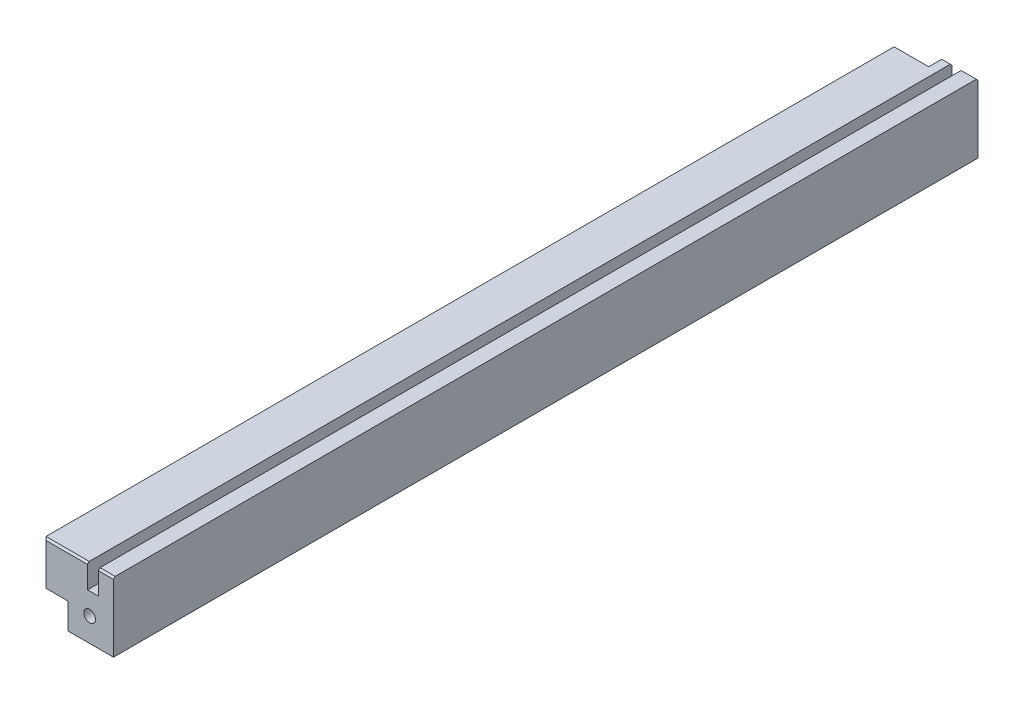
ISO-10303-21;
HEADER;
FILE_DESCRIPTION(('STEP AP214'),'2;1');
FILE_NAME('part.step','',(''),(''),'','','');
FILE_SCHEMA(('AUTOMOTIVE_DESIGN { 1 0 10303 214 1 1 1 1 }'));
ENDSEC;
DATA;
#1=APPLICATION_CONTEXT('core data for automotive mechanical design processes');
#2=APPLICATION_PROTOCOL_DEFINITION('international standard','automotive_design',2000,#1);
#3=PRODUCT_CONTEXT('',#1,'mechanical');
#4=PRODUCT('Part','Part','',(#3));
#5=PRODUCT_RELATED_PRODUCT_CATEGORY('part','',(#4));
#6=PRODUCT_DEFINITION_FORMATION('','',#4);
#7=PRODUCT_DEFINITION_CONTEXT('part definition',#1,'design');
#8=PRODUCT_DEFINITION('design','',#6,#7);
#9=PRODUCT_DEFINITION_SHAPE('','',#8);
#10=(LENGTH_UNIT() NAMED_UNIT(*) SI_UNIT(.MILLI.,.METRE.));
#11=(NAMED_UNIT(*) PLANE_ANGLE_UNIT() SI_UNIT($,.RADIAN.));
#12=(NAMED_UNIT(*) SI_UNIT($,.STERADIAN.) SOLID_ANGLE_UNIT());
#13=UNCERTAINTY_MEASURE_WITH_UNIT(LENGTH_MEASURE(1.E-05),#10,'distance_accuracy_value','');
#14=(GEOMETRIC_REPRESENTATION_CONTEXT(3) GLOBAL_UNCERTAINTY_ASSIGNED_CONTEXT((#13)) GLOBAL_UNIT_ASSIGNED_CONTEXT((#10,
#11,#12)) REPRESENTATION_CONTEXT('',''));
#15=CARTESIAN_POINT('',(0.,0.,0.));
#16=DIRECTION('',(0.,0.,1.));
#17=DIRECTION('',(1.,0.,0.));
#18=AXIS2_PLACEMENT_3D('',#15,#16,#17);
#19=CARTESIAN_POINT('',(-85.5964354489641,5.89468172148585,200.));
#20=DIRECTION('',(0.,-1.,0.));
#21=DIRECTION('',(0.,0.,-1.));
#22=AXIS2_PLACEMENT_3D('',#19,#20,#21);
#23=PLANE('',#22);
#24=DIRECTION('',(0.,0.,-1.));
#25=VECTOR('',#24,1.);
#26=CARTESIAN_POINT('',(-85.5964354489641,5.89468172148585,200.));
#27=LINE('',#26,#25);
#28=CARTESIAN_POINT('',(-85.5964354489641,5.89468172148585,199.6));
#29=VERTEX_POINT('',#28);
#30=CARTESIAN_POINT('',(-85.5964354489641,5.89468172148585,0.400000000000026));
#31=VERTEX_POINT('',#30);
#32=EDGE_CURVE('E222',#29,#31,#27,.T.);
#33=ORIENTED_EDGE('',*,*,#32,.T.);
#34=DIRECTION('',(1.,0.,0.));
#35=VECTOR('',#34,1.);
#36=CARTESIAN_POINT('',(-85.5964354489641,5.89468172148585,0.400000000000026));
#37=LINE('',#36,#35);
#38=CARTESIAN_POINT('',(-89.0964354489641,5.89468172148585,0.400000000000026));
#39=VERTEX_POINT('',#38);
#40=EDGE_CURVE('E261',#39,#31,#37,.T.);
#41=ORIENTED_EDGE('',*,*,#40,.F.);
#42=DIRECTION('',(0.,0.,1.));
#43=VECTOR('',#42,1.);
#44=CARTESIAN_POINT('',(-89.0964354489641,5.89468172148585,0.));
#45=LINE('',#44,#43);
#46=CARTESIAN_POINT('',(-89.0964354489641,5.89468172148585,199.6));
#47=VERTEX_POINT('',#46);
#48=EDGE_CURVE('E216',#39,#47,#45,.T.);
#49=ORIENTED_EDGE('',*,*,#48,.T.);
#50=DIRECTION('',(-1.,0.,0.));
#51=VECTOR('',#50,1.);
#52=CARTESIAN_POINT('',(-89.0964354489641,5.89468172148585,199.6));
#53=LINE('',#52,#51);
#54=EDGE_CURVE('E264',#29,#47,#53,.T.);
#55=ORIENTED_EDGE('',*,*,#54,.F.);
#56=EDGE_LOOP('',(#33,#41,#49,#55));
#57=FACE_BOUND('',#56,.T.);
#58=ADVANCED_FACE('F37',(#57),#23,.F.);
#59=CARTESIAN_POINT('',(-101.596435448964,5.89468172148584,200.));
#60=DIRECTION('',(1.,0.,0.));
#61=DIRECTION('',(0.,-1.,0.));
#62=AXIS2_PLACEMENT_3D('',#59,#60,#61);
#63=PLANE('',#62);
#64=DIRECTION('',(0.,0.,-1.));
#65=VECTOR('',#64,1.);
#66=CARTESIAN_POINT('',(-101.596435448964,-2.10531827851416,3.00000000000006));
#67=LINE('',#66,#65);
#68=CARTESIAN_POINT('',(-101.596435448964,-2.10531827851416,3.40000000000005));
#69=VERTEX_POINT('',#68);
#70=CARTESIAN_POINT('',(-101.596435448964,-2.10531827851416,0.400000000000033));
#71=VERTEX_POINT('',#70);
#72=EDGE_CURVE('E319',#69,#71,#67,.T.);
#73=ORIENTED_EDGE('',*,*,#72,.T.);
#74=DIRECTION('',(0.,1.,0.));
#75=VECTOR('',#74,1.);
#76=CARTESIAN_POINT('',(-101.596435448964,5.89468172148584,0.400000000000026));
#77=LINE('',#76,#75);
#78=CARTESIAN_POINT('',(-101.596435448964,-4.10531827851416,0.400000000000026));
#79=VERTEX_POINT('',#78);
#80=EDGE_CURVE('E236',#79,#71,#77,.T.);
#81=ORIENTED_EDGE('',*,*,#80,.F.);
#82=DIRECTION('',(0.,0.,1.));
#83=VECTOR('',#82,1.);
#84=CARTESIAN_POINT('',(-101.596435448964,-4.10531827851416,0.));
#85=LINE('',#84,#83);
#86=CARTESIAN_POINT('',(-101.596435448964,-4.10531827851416,199.6));
#87=VERTEX_POINT('',#86);
#88=EDGE_CURVE('E198',#79,#87,#85,.T.);
#89=ORIENTED_EDGE('',*,*,#88,.T.);
#90=DIRECTION('',(0.,-1.,0.));
#91=VECTOR('',#90,1.);
#92=CARTESIAN_POINT('',(-101.596435448964,-4.10531827851416,199.6));
#93=LINE('',#92,#91);
#94=CARTESIAN_POINT('',(-101.596435448964,5.89468172148584,199.6));
#95=VERTEX_POINT('',#94);
#96=EDGE_CURVE('E239',#95,#87,#93,.T.);
#97=ORIENTED_EDGE('',*,*,#96,.F.);
#98=DIRECTION('',(0.,0.,-1.));
#99=VECTOR('',#98,1.);
#100=CARTESIAN_POINT('',(-101.596435448964,5.89468172148584,200.));
#101=LINE('',#100,#99);
#102=CARTESIAN_POINT('',(-101.596435448964,5.89468172148584,3.40000000000005));
#103=VERTEX_POINT('',#102);
#104=EDGE_CURVE('E225',#95,#103,#101,.T.);
#105=ORIENTED_EDGE('',*,*,#104,.T.);
#106=DIRECTION('',(0.,1.,0.));
#107=VECTOR('',#106,1.);
#108=CARTESIAN_POINT('',(-101.596435448964,5.89468172148584,3.40000000000005));
#109=LINE('',#108,#107);
#110=EDGE_CURVE('E293',#69,#103,#109,.T.);
#111=ORIENTED_EDGE('',*,*,#110,.F.);
#112=EDGE_LOOP('',(#73,#81,#89,#97,#105,#111));
#113=FACE_BOUND('',#112,.T.);
#114=ADVANCED_FACE('F368',(#113),#63,.F.);
#115=ORIENTED_EDGE('',*,*,#104,.F.);
#116=DIRECTION('',(-1.,0.,0.));
#117=VECTOR('',#116,1.);
#118=CARTESIAN_POINT('',(-101.596435448964,5.89468172148584,199.6));
#119=LINE('',#118,#117);
#120=CARTESIAN_POINT('',(-91.5964354489641,5.89468172148585,199.6));
#121=VERTEX_POINT('',#120);
#122=EDGE_CURVE('E253',#121,#95,#119,.T.);
#123=ORIENTED_EDGE('',*,*,#122,.F.);
#124=DIRECTION('',(0.,0.,1.));
#125=VECTOR('',#124,1.);
#126=CARTESIAN_POINT('',(-91.5964354489641,5.89468172148585,0.));
#127=LINE('',#126,#125);
#128=CARTESIAN_POINT('',(-91.5964354489641,5.89468172148585,0.400000000000026));
#129=VERTEX_POINT('',#128);
#130=EDGE_CURVE('E351',#129,#121,#127,.T.);
#131=ORIENTED_EDGE('',*,*,#130,.F.);
#132=DIRECTION('',(1.,0.,0.));
#133=VECTOR('',#132,1.);
#134=CARTESIAN_POINT('',(-85.5964354489641,5.89468172148585,0.400000000000026));
#135=LINE('',#134,#133);
#136=CARTESIAN_POINT('',(-93.5964354489641,5.89468172148585,0.400000000000027));
#137=VERTEX_POINT('',#136);
#138=EDGE_CURVE('E250',#137,#129,#135,.T.);
#139=ORIENTED_EDGE('',*,*,#138,.F.);
#140=DIRECTION('',(0.,0.,-1.));
#141=VECTOR('',#140,1.);
#142=CARTESIAN_POINT('',(-93.5964354489641,5.89468172148585,3.00000000000006));
#143=LINE('',#142,#141);
#144=CARTESIAN_POINT('',(-93.5964354489641,5.89468172148585,3.40000000000005));
#145=VERTEX_POINT('',#144);
#146=EDGE_CURVE('E303',#145,#137,#143,.T.);
#147=ORIENTED_EDGE('',*,*,#146,.F.);
#148=DIRECTION('',(1.,0.,0.));
#149=VECTOR('',#148,1.);
#150=CARTESIAN_POINT('',(-93.5964354489641,5.89468172148585,3.40000000000005));
#151=LINE('',#150,#149);
#152=EDGE_CURVE('E295',#103,#145,#151,.T.);
#153=ORIENTED_EDGE('',*,*,#152,.F.);
#154=EDGE_LOOP('',(#115,#123,#131,#139,#147,#153));
#155=FACE_BOUND('',#154,.T.);
#156=ADVANCED_FACE('F304',(#155),#23,.F.);
#157=CARTESIAN_POINT('',(-85.5964354489641,5.89468172148585,200.));
#158=DIRECTION('',(-1.,0.,0.));
#159=DIRECTION('',(0.,1.,0.));
#160=AXIS2_PLACEMENT_3D('',#157,#158,#159);
#161=PLANE('',#160);
#162=DIRECTION('',(0.,-1.,0.));
#163=VECTOR('',#162,1.);
#164=CARTESIAN_POINT('',(-85.5964354489641,5.89468172148585,200.));
#165=LINE('',#164,#163);
#166=CARTESIAN_POINT('',(-85.5964354489641,5.49468172148584,200.));
#167=VERTEX_POINT('',#166);
#168=CARTESIAN_POINT('',(-85.5964354489641,-10.1053182785142,200.));
#169=VERTEX_POINT('',#168);
#170=EDGE_CURVE('E212',#167,#169,#165,.T.);
#171=ORIENTED_EDGE('',*,*,#170,.T.);
#172=DIRECTION('',(0.,0.,-1.));
#173=VECTOR('',#172,1.);
#174=CARTESIAN_POINT('',(-85.5964354489641,-10.1053182785142,200.));
#175=LINE('',#174,#173);
#176=CARTESIAN_POINT('',(-85.5964354489641,-10.1053182785142,0.));
#177=VERTEX_POINT('',#176);
#178=EDGE_CURVE('E220',#169,#177,#175,.T.);
#179=ORIENTED_EDGE('',*,*,#178,.T.);
#180=DIRECTION('',(0.,-1.,0.));
#181=VECTOR('',#180,1.);
#182=CARTESIAN_POINT('',(-85.5964354489641,5.89468172148585,0.));
#183=LINE('',#182,#181);
#184=CARTESIAN_POINT('',(-85.5964354489641,5.49468172148584,0.));
#185=VERTEX_POINT('',#184);
#186=EDGE_CURVE('E210',#185,#177,#183,.T.);
#187=ORIENTED_EDGE('',*,*,#186,.F.);
#188=DIRECTION('',(0.,0.707106781186548,0.707106781186548));
#189=VECTOR('',#188,1.);
#190=CARTESIAN_POINT('',(-85.5964354489641,5.89468172148585,0.400000000000026));
#191=LINE('',#190,#189);
#192=EDGE_CURVE('E256',#31,#185,#191,.F.);
#193=ORIENTED_EDGE('',*,*,#192,.F.);
#194=ORIENTED_EDGE('',*,*,#32,.F.);
#195=DIRECTION('',(0.,0.707106781186548,-0.707106781186548));
#196=VECTOR('',#195,1.);
#197=CARTESIAN_POINT('',(-85.5964354489641,5.49468172148584,200.));
#198=LINE('',#197,#196);
#199=EDGE_CURVE('E259',#167,#29,#198,.T.);
#200=ORIENTED_EDGE('',*,*,#199,.F.);
#201=EDGE_LOOP('',(#171,#179,#187,#193,#194,#200));
#202=FACE_BOUND('',#201,.T.);
#203=ADVANCED_FACE('F439',(#202),#161,.F.);
#204=CARTESIAN_POINT('',(-85.5964354489641,-10.1053182785142,200.));
#205=DIRECTION('',(0.,1.,0.));
#206=DIRECTION('',(0.,0.,1.));
#207=AXIS2_PLACEMENT_3D('',#204,#205,#206);
#208=PLANE('',#207);
#209=DIRECTION('',(-1.,0.,0.));
#210=VECTOR('',#209,1.);
#211=CARTESIAN_POINT('',(-85.5964354489641,-10.1053182785142,0.));
#212=LINE('',#211,#210);
#213=CARTESIAN_POINT('',(-96.0964354489642,-10.1053182785142,0.));
#214=VERTEX_POINT('',#213);
#215=EDGE_CURVE('E204',#177,#214,#212,.T.);
#216=ORIENTED_EDGE('',*,*,#215,.F.);
#217=ORIENTED_EDGE('',*,*,#178,.F.);
#218=DIRECTION('',(-1.,0.,0.));
#219=VECTOR('',#218,1.);
#220=CARTESIAN_POINT('',(-85.5964354489641,-10.1053182785142,200.));
#221=LINE('',#220,#219);
#222=CARTESIAN_POINT('',(-96.0964354489642,-10.1053182785142,200.));
#223=VERTEX_POINT('',#222);
#224=EDGE_CURVE('E206',#169,#223,#221,.T.);
#225=ORIENTED_EDGE('',*,*,#224,.T.);
#226=DIRECTION('',(0.,0.,-1.));
#227=VECTOR('',#226,1.);
#228=CARTESIAN_POINT('',(-96.0964354489642,-10.1053182785142,0.));
#229=LINE('',#228,#227);
#230=EDGE_CURVE('E191',#223,#214,#229,.T.);
#231=ORIENTED_EDGE('',*,*,#230,.T.);
#232=EDGE_LOOP('',(#216,#217,#225,#231));
#233=FACE_BOUND('',#232,.T.);
#234=ADVANCED_FACE('F202',(#233),#208,.F.);
#235=CARTESIAN_POINT('',(-93.5964354489641,-2.10531827851415,200.));
#236=DIRECTION('',(0.,0.,1.));
#237=DIRECTION('',(-1.,0.,0.));
#238=AXIS2_PLACEMENT_3D('',#235,#236,#237);
#239=PLANE('',#238);
#240=ORIENTED_EDGE('',*,*,#224,.F.);
#241=ORIENTED_EDGE('',*,*,#170,.F.);
#242=DIRECTION('',(1.,0.,0.));
#243=VECTOR('',#242,1.);
#244=CARTESIAN_POINT('',(-85.5964354489641,5.49468172148584,200.));
#245=LINE('',#244,#243);
#246=CARTESIAN_POINT('',(-89.0964354489641,5.49468172148584,200.));
#247=VERTEX_POINT('',#246);
#248=EDGE_CURVE('E228',#247,#167,#245,.T.);
#249=ORIENTED_EDGE('',*,*,#248,.F.);
#250=DIRECTION('',(0.,-1.,0.));
#251=VECTOR('',#250,1.);
#252=CARTESIAN_POINT('',(-89.0964354489641,5.89468172148585,200.));
#253=LINE('',#252,#251);
#254=CARTESIAN_POINT('',(-89.0964354489641,0.394681721485848,200.));
#255=VERTEX_POINT('',#254);
#256=EDGE_CURVE('E341',#247,#255,#253,.T.);
#257=ORIENTED_EDGE('',*,*,#256,.T.);
#258=DIRECTION('',(-1.,0.,0.));
#259=VECTOR('',#258,1.);
#260=CARTESIAN_POINT('',(-89.0964354489641,0.394681721485848,200.));
#261=LINE('',#260,#259);
#262=CARTESIAN_POINT('',(-91.5964354489641,0.394681721485847,200.));
#263=VERTEX_POINT('',#262);
#264=EDGE_CURVE('E344',#255,#263,#261,.T.);
#265=ORIENTED_EDGE('',*,*,#264,.T.);
#266=DIRECTION('',(0.,1.,0.));
#267=VECTOR('',#266,1.);
#268=CARTESIAN_POINT('',(-91.5964354489641,5.89468172148585,200.));
#269=LINE('',#268,#267);
#270=CARTESIAN_POINT('',(-91.5964354489641,5.49468172148584,200.));
#271=VERTEX_POINT('',#270);
#272=EDGE_CURVE('E334',#263,#271,#269,.T.);
#273=ORIENTED_EDGE('',*,*,#272,.T.);
#274=DIRECTION('',(1.,0.,0.));
#275=VECTOR('',#274,1.);
#276=CARTESIAN_POINT('',(-91.5964354489641,5.49468172148584,200.));
#277=LINE('',#276,#275);
#278=CARTESIAN_POINT('',(-101.196435448964,5.49468172148583,200.));
#279=VERTEX_POINT('',#278);
#280=EDGE_CURVE('E230',#279,#271,#277,.T.);
#281=ORIENTED_EDGE('',*,*,#280,.F.);
#282=DIRECTION('',(0.,1.,0.));
#283=VECTOR('',#282,1.);
#284=CARTESIAN_POINT('',(-101.196435448964,5.89468172148584,200.));
#285=LINE('',#284,#283);
#286=CARTESIAN_POINT('',(-101.196435448964,-4.10531827851416,200.));
#287=VERTEX_POINT('',#286);
#288=EDGE_CURVE('E233',#287,#279,#285,.T.);
#289=ORIENTED_EDGE('',*,*,#288,.F.);
#290=DIRECTION('',(1.,0.,0.));
#291=VECTOR('',#290,1.);
#292=CARTESIAN_POINT('',(-101.596435448964,-4.10531827851416,200.));
#293=LINE('',#292,#291);
#294=CARTESIAN_POINT('',(-96.0964354489642,-4.10531827851416,200.));
#295=VERTEX_POINT('',#294);
#296=EDGE_CURVE('E283',#287,#295,#293,.T.);
#297=ORIENTED_EDGE('',*,*,#296,.T.);
#298=DIRECTION('',(0.,-1.,0.));
#299=VECTOR('',#298,1.);
#300=CARTESIAN_POINT('',(-96.0964354489642,-6.60531827851416,200.));
#301=LINE('',#300,#299);
#302=EDGE_CURVE('E357',#295,#223,#301,.T.);
#303=ORIENTED_EDGE('',*,*,#302,.T.);
#304=EDGE_LOOP('',(#240,#241,#249,#257,#265,#273,#281,#289,#297,#303));
#305=FACE_BOUND('',#304,.T.);
#306=CARTESIAN_POINT('',(-91.0964354489641,-4.60531827851415,200.));
#307=DIRECTION('',(0.,0.,-1.));
#308=DIRECTION('',(-1.,0.,0.));
#309=AXIS2_PLACEMENT_3D('',#306,#307,#308);
#310=CIRCLE('',#309,1.34999999999999);
#311=CARTESIAN_POINT('',(-92.4464354489641,-4.60531827851416,200.));
#312=VERTEX_POINT('',#311);
#313=EDGE_CURVE('E306',#312,#312,#310,.T.);
#314=ORIENTED_EDGE('',*,*,#313,.T.);
#315=EDGE_LOOP('',(#314));
#316=FACE_BOUND('',#315,.T.);
#317=ADVANCED_FACE('F389',(#305,#316),#239,.T.);
#318=CARTESIAN_POINT('',(-93.5964354489641,-2.10531827851415,0.));
#319=DIRECTION('',(0.,0.,1.));
#320=DIRECTION('',(-1.,0.,0.));
#321=AXIS2_PLACEMENT_3D('',#318,#319,#320);
#322=PLANE('',#321);
#323=CARTESIAN_POINT('',(-91.0964354489641,-4.60531827851415,0.));
#324=DIRECTION('',(0.,0.,1.));
#325=DIRECTION('',(1.,0.,0.));
#326=AXIS2_PLACEMENT_3D('',#323,#324,#325);
#327=CIRCLE('',#326,1.34999999999999);
#328=CARTESIAN_POINT('',(-89.7464354489642,-4.60531827851415,0.));
#329=VERTEX_POINT('',#328);
#330=EDGE_CURVE('E325',#329,#329,#327,.T.);
#331=ORIENTED_EDGE('',*,*,#330,.T.);
#332=EDGE_LOOP('',(#331));
#333=FACE_BOUND('',#332,.T.);
#334=DIRECTION('',(0.,-1.,0.));
#335=VECTOR('',#334,1.);
#336=CARTESIAN_POINT('',(-96.0964354489642,-6.60531827851416,0.));
#337=LINE('',#336,#335);
#338=CARTESIAN_POINT('',(-96.0964354489642,-4.10531827851416,0.));
#339=VERTEX_POINT('',#338);
#340=EDGE_CURVE('E187',#339,#214,#337,.T.);
#341=ORIENTED_EDGE('',*,*,#340,.F.);
#342=DIRECTION('',(1.,0.,0.));
#343=VECTOR('',#342,1.);
#344=CARTESIAN_POINT('',(-101.596435448964,-4.10531827851416,0.));
#345=LINE('',#344,#343);
#346=CARTESIAN_POINT('',(-101.196435448964,-4.10531827851416,0.));
#347=VERTEX_POINT('',#346);
#348=EDGE_CURVE('E199',#347,#339,#345,.T.);
#349=ORIENTED_EDGE('',*,*,#348,.F.);
#350=DIRECTION('',(0.,-1.,0.));
#351=VECTOR('',#350,1.);
#352=CARTESIAN_POINT('',(-101.196435448964,-2.10531827851416,0.));
#353=LINE('',#352,#351);
#354=CARTESIAN_POINT('',(-101.196435448964,-2.10531827851416,0.));
#355=VERTEX_POINT('',#354);
#356=EDGE_CURVE('E274',#355,#347,#353,.T.);
#357=ORIENTED_EDGE('',*,*,#356,.F.);
#358=DIRECTION('',(1.,0.,0.));
#359=VECTOR('',#358,1.);
#360=CARTESIAN_POINT('',(-101.596435448964,-2.10531827851416,0.));
#361=LINE('',#360,#359);
#362=CARTESIAN_POINT('',(-96.5964354489642,-2.10531827851416,0.));
#363=VERTEX_POINT('',#362);
#364=EDGE_CURVE('E384',#355,#363,#361,.T.);
#365=ORIENTED_EDGE('',*,*,#364,.T.);
#366=CARTESIAN_POINT('',(-96.5964354489642,0.894681721485843,0.));
#367=DIRECTION('',(0.,0.,1.));
#368=DIRECTION('',(1.,0.,0.));
#369=AXIS2_PLACEMENT_3D('',#366,#367,#368);
#370=CIRCLE('',#369,3.);
#371=CARTESIAN_POINT('',(-93.5964354489641,0.894681721485845,0.));
#372=VERTEX_POINT('',#371);
#373=EDGE_CURVE('E405',#363,#372,#370,.T.);
#374=ORIENTED_EDGE('',*,*,#373,.T.);
#375=DIRECTION('',(0.,1.,0.));
#376=VECTOR('',#375,1.);
#377=CARTESIAN_POINT('',(-93.5964354489641,5.89468172148585,0.));
#378=LINE('',#377,#376);
#379=CARTESIAN_POINT('',(-93.5964354489641,5.49468172148583,0.));
#380=VERTEX_POINT('',#379);
#381=EDGE_CURVE('E315',#372,#380,#378,.T.);
#382=ORIENTED_EDGE('',*,*,#381,.T.);
#383=DIRECTION('',(-1.,0.,0.));
#384=VECTOR('',#383,1.);
#385=CARTESIAN_POINT('',(-93.5964354489641,5.49468172148583,0.));
#386=LINE('',#385,#384);
#387=CARTESIAN_POINT('',(-91.5964354489641,5.49468172148584,0.));
#388=VERTEX_POINT('',#387);
#389=EDGE_CURVE('E277',#388,#380,#386,.T.);
#390=ORIENTED_EDGE('',*,*,#389,.F.);
#391=DIRECTION('',(0.,1.,0.));
#392=VECTOR('',#391,1.);
#393=CARTESIAN_POINT('',(-91.5964354489641,5.89468172148585,0.));
#394=LINE('',#393,#392);
#395=CARTESIAN_POINT('',(-91.5964354489641,0.394681721485847,0.));
#396=VERTEX_POINT('',#395);
#397=EDGE_CURVE('E337',#396,#388,#394,.T.);
#398=ORIENTED_EDGE('',*,*,#397,.F.);
#399=DIRECTION('',(-1.,0.,0.));
#400=VECTOR('',#399,1.);
#401=CARTESIAN_POINT('',(-89.0964354489641,0.394681721485848,0.));
#402=LINE('',#401,#400);
#403=CARTESIAN_POINT('',(-89.0964354489641,0.394681721485848,0.));
#404=VERTEX_POINT('',#403);
#405=EDGE_CURVE('E333',#404,#396,#402,.T.);
#406=ORIENTED_EDGE('',*,*,#405,.F.);
#407=DIRECTION('',(0.,-1.,0.));
#408=VECTOR('',#407,1.);
#409=CARTESIAN_POINT('',(-89.0964354489641,5.89468172148585,0.));
#410=LINE('',#409,#408);
#411=CARTESIAN_POINT('',(-89.0964354489641,5.49468172148584,0.));
#412=VERTEX_POINT('',#411);
#413=EDGE_CURVE('E330',#412,#404,#410,.T.);
#414=ORIENTED_EDGE('',*,*,#413,.F.);
#415=DIRECTION('',(-1.,0.,0.));
#416=VECTOR('',#415,1.);
#417=CARTESIAN_POINT('',(-93.5964354489641,5.49468172148583,0.));
#418=LINE('',#417,#416);
#419=EDGE_CURVE('E271',#185,#412,#418,.T.);
#420=ORIENTED_EDGE('',*,*,#419,.F.);
#421=ORIENTED_EDGE('',*,*,#186,.T.);
#422=ORIENTED_EDGE('',*,*,#215,.T.);
#423=EDGE_LOOP('',(#341,#349,#357,#365,#374,#382,#390,#398,#406,#414,#420,#421,#422));
#424=FACE_BOUND('',#423,.T.);
#425=ADVANCED_FACE('F208',(#333,#424),#322,.F.);
#426=CARTESIAN_POINT('',(-96.0964354489642,-6.60531827851416,0.));
#427=DIRECTION('',(1.,0.,0.));
#428=DIRECTION('',(0.,0.,1.));
#429=AXIS2_PLACEMENT_3D('',#426,#427,#428);
#430=PLANE('',#429);
#431=ORIENTED_EDGE('',*,*,#302,.F.);
#432=DIRECTION('',(0.,0.,1.));
#433=VECTOR('',#432,1.);
#434=CARTESIAN_POINT('',(-96.0964354489642,-4.10531827851416,0.));
#435=LINE('',#434,#433);
#436=EDGE_CURVE('E193',#339,#295,#435,.T.);
#437=ORIENTED_EDGE('',*,*,#436,.F.);
#438=ORIENTED_EDGE('',*,*,#340,.T.);
#439=ORIENTED_EDGE('',*,*,#230,.F.);
#440=EDGE_LOOP('',(#431,#437,#438,#439));
#441=FACE_BOUND('',#440,.T.);
#442=ADVANCED_FACE('F190',(#441),#430,.F.);
#443=CARTESIAN_POINT('',(-101.596435448964,-4.10531827851416,0.));
#444=DIRECTION('',(0.,1.,0.));
#445=DIRECTION('',(1.,0.,0.));
#446=AXIS2_PLACEMENT_3D('',#443,#444,#445);
#447=PLANE('',#446);
#448=ORIENTED_EDGE('',*,*,#88,.F.);
#449=DIRECTION('',(0.707106781186548,0.,-0.707106781186548));
#450=VECTOR('',#449,1.);
#451=CARTESIAN_POINT('',(-101.596435448964,-4.10531827851416,0.400000000000026));
#452=LINE('',#451,#450);
#453=EDGE_CURVE('E242',#347,#79,#452,.F.);
#454=ORIENTED_EDGE('',*,*,#453,.F.);
#455=ORIENTED_EDGE('',*,*,#348,.T.);
#456=ORIENTED_EDGE('',*,*,#436,.T.);
#457=ORIENTED_EDGE('',*,*,#296,.F.);
#458=DIRECTION('',(0.707106781186548,0.,0.707106781186548));
#459=VECTOR('',#458,1.);
#460=CARTESIAN_POINT('',(-101.196435448964,-4.10531827851416,200.));
#461=LINE('',#460,#459);
#462=EDGE_CURVE('E244',#87,#287,#461,.T.);
#463=ORIENTED_EDGE('',*,*,#462,.F.);
#464=EDGE_LOOP('',(#448,#454,#455,#456,#457,#463));
#465=FACE_BOUND('',#464,.T.);
#466=ADVANCED_FACE('F370',(#465),#447,.F.);
#467=CARTESIAN_POINT('',(-89.0964354489641,5.89468172148585,0.));
#468=DIRECTION('',(1.,0.,0.));
#469=DIRECTION('',(0.,-1.,0.));
#470=AXIS2_PLACEMENT_3D('',#467,#468,#469);
#471=PLANE('',#470);
#472=ORIENTED_EDGE('',*,*,#48,.F.);
#473=DIRECTION('',(0.,-0.707106781186548,-0.707106781186548));
#474=VECTOR('',#473,1.);
#475=CARTESIAN_POINT('',(-89.0964354489641,5.89468172148585,0.400000000000026));
#476=LINE('',#475,#474);
#477=EDGE_CURVE('E267',#412,#39,#476,.F.);
#478=ORIENTED_EDGE('',*,*,#477,.F.);
#479=ORIENTED_EDGE('',*,*,#413,.T.);
#480=DIRECTION('',(0.,0.,1.));
#481=VECTOR('',#480,1.);
#482=CARTESIAN_POINT('',(-89.0964354489641,0.394681721485848,0.));
#483=LINE('',#482,#481);
#484=EDGE_CURVE('E340',#404,#255,#483,.T.);
#485=ORIENTED_EDGE('',*,*,#484,.T.);
#486=ORIENTED_EDGE('',*,*,#256,.F.);
#487=DIRECTION('',(0.,-0.707106781186548,0.707106781186548));
#488=VECTOR('',#487,1.);
#489=CARTESIAN_POINT('',(-89.0964354489641,5.49468172148584,200.));
#490=LINE('',#489,#488);
#491=EDGE_CURVE('E269',#47,#247,#490,.T.);
#492=ORIENTED_EDGE('',*,*,#491,.F.);
#493=EDGE_LOOP('',(#472,#478,#479,#485,#486,#492));
#494=FACE_BOUND('',#493,.T.);
#495=ADVANCED_FACE('F456',(#494),#471,.F.);
#496=CARTESIAN_POINT('',(-91.5964354489641,5.89468172148585,0.));
#497=DIRECTION('',(-1.,0.,0.));
#498=DIRECTION('',(0.,1.,0.));
#499=AXIS2_PLACEMENT_3D('',#496,#497,#498);
#500=PLANE('',#499);
#501=ORIENTED_EDGE('',*,*,#272,.F.);
#502=DIRECTION('',(0.,0.,1.));
#503=VECTOR('',#502,1.);
#504=CARTESIAN_POINT('',(-91.5964354489641,0.394681721485847,0.));
#505=LINE('',#504,#503);
#506=EDGE_CURVE('E354',#396,#263,#505,.T.);
#507=ORIENTED_EDGE('',*,*,#506,.F.);
#508=ORIENTED_EDGE('',*,*,#397,.T.);
#509=DIRECTION('',(0.,0.707106781186548,0.707106781186548));
#510=VECTOR('',#509,1.);
#511=CARTESIAN_POINT('',(-91.5964354489641,5.89468172148585,0.400000000000027));
#512=LINE('',#511,#510);
#513=EDGE_CURVE('E246',#129,#388,#512,.F.);
#514=ORIENTED_EDGE('',*,*,#513,.F.);
#515=ORIENTED_EDGE('',*,*,#130,.T.);
#516=DIRECTION('',(0.,0.707106781186548,-0.707106781186548));
#517=VECTOR('',#516,1.);
#518=CARTESIAN_POINT('',(-91.5964354489641,5.49468172148584,200.));
#519=LINE('',#518,#517);
#520=EDGE_CURVE('E248',#271,#121,#519,.T.);
#521=ORIENTED_EDGE('',*,*,#520,.F.);
#522=EDGE_LOOP('',(#501,#507,#508,#514,#515,#521));
#523=FACE_BOUND('',#522,.T.);
#524=ADVANCED_FACE('F394',(#523),#500,.F.);
#525=CARTESIAN_POINT('',(-89.0964354489641,0.394681721485848,0.));
#526=DIRECTION('',(0.,-1.,0.));
#527=DIRECTION('',(0.,0.,-1.));
#528=AXIS2_PLACEMENT_3D('',#525,#526,#527);
#529=PLANE('',#528);
#530=ORIENTED_EDGE('',*,*,#264,.F.);
#531=ORIENTED_EDGE('',*,*,#484,.F.);
#532=ORIENTED_EDGE('',*,*,#405,.T.);
#533=ORIENTED_EDGE('',*,*,#506,.T.);
#534=EDGE_LOOP('',(#530,#531,#532,#533));
#535=FACE_BOUND('',#534,.T.);
#536=ADVANCED_FACE('F462',(#535),#529,.F.);
#537=CARTESIAN_POINT('',(-93.5964354489641,5.49468172148583,200.));
#538=DIRECTION('',(0.,0.707106781186548,0.707106781186548));
#539=DIRECTION('',(-1.,0.,0.));
#540=AXIS2_PLACEMENT_3D('',#537,#538,#539);
#541=PLANE('',#540);
#542=ORIENTED_EDGE('',*,*,#520,.T.);
#543=ORIENTED_EDGE('',*,*,#122,.T.);
#544=DIRECTION('',(-0.577350269189626,0.577350269189626,-0.577350269189626));
#545=VECTOR('',#544,1.);
#546=CARTESIAN_POINT('',(-98.6631021156308,2.9613483881525,202.533333333333));
#547=LINE('',#546,#545);
#548=EDGE_CURVE('E281',#95,#279,#547,.F.);
#549=ORIENTED_EDGE('',*,*,#548,.T.);
#550=ORIENTED_EDGE('',*,*,#280,.T.);
#551=EDGE_LOOP('',(#542,#543,#549,#550));
#552=FACE_BOUND('',#551,.T.);
#553=ADVANCED_FACE('F378',(#552),#541,.T.);
#554=CARTESIAN_POINT('',(-101.196435448964,-2.10531827851416,200.));
#555=DIRECTION('',(-0.707106781186548,0.,0.707106781186548));
#556=DIRECTION('',(0.,-1.,0.));
#557=AXIS2_PLACEMENT_3D('',#554,#555,#556);
#558=PLANE('',#557);
#559=ORIENTED_EDGE('',*,*,#462,.T.);
#560=ORIENTED_EDGE('',*,*,#288,.T.);
#561=ORIENTED_EDGE('',*,*,#548,.F.);
#562=ORIENTED_EDGE('',*,*,#96,.T.);
#563=EDGE_LOOP('',(#559,#560,#561,#562));
#564=FACE_BOUND('',#563,.T.);
#565=ADVANCED_FACE('F374',(#564),#558,.T.);
#566=CARTESIAN_POINT('',(-93.5964354489641,5.49468172148583,200.));
#567=DIRECTION('',(0.,0.707106781186548,0.707106781186548));
#568=DIRECTION('',(-1.,0.,0.));
#569=AXIS2_PLACEMENT_3D('',#566,#567,#568);
#570=PLANE('',#569);
#571=ORIENTED_EDGE('',*,*,#491,.T.);
#572=ORIENTED_EDGE('',*,*,#248,.T.);
#573=ORIENTED_EDGE('',*,*,#199,.T.);
#574=ORIENTED_EDGE('',*,*,#54,.T.);
#575=EDGE_LOOP('',(#571,#572,#573,#574));
#576=FACE_BOUND('',#575,.T.);
#577=ADVANCED_FACE('F538',(#576),#570,.T.);
#578=CARTESIAN_POINT('',(-101.596435448964,5.89468172148584,0.400000000000026));
#579=DIRECTION('',(0.707106781186548,0.,0.707106781186548));
#580=DIRECTION('',(0.,1.,0.));
#581=AXIS2_PLACEMENT_3D('',#578,#579,#580);
#582=PLANE('',#581);
#583=DIRECTION('',(-0.707106781186548,0.,0.707106781186548));
#584=VECTOR('',#583,1.);
#585=CARTESIAN_POINT('',(-101.596435448964,-2.10531827851416,0.400000000000025));
#586=LINE('',#585,#584);
#587=EDGE_CURVE('E286',#71,#355,#586,.F.);
#588=ORIENTED_EDGE('',*,*,#587,.T.);
#589=ORIENTED_EDGE('',*,*,#356,.T.);
#590=ORIENTED_EDGE('',*,*,#453,.T.);
#591=ORIENTED_EDGE('',*,*,#80,.T.);
#592=EDGE_LOOP('',(#588,#589,#590,#591));
#593=FACE_BOUND('',#592,.T.);
#594=ADVANCED_FACE('F387',(#593),#582,.F.);
#595=CARTESIAN_POINT('',(-85.5964354489641,5.89468172148585,0.400000000000026));
#596=DIRECTION('',(0.,-0.707106781186548,0.707106781186548));
#597=DIRECTION('',(1.,0.,0.));
#598=AXIS2_PLACEMENT_3D('',#595,#596,#597);
#599=PLANE('',#598);
#600=DIRECTION('',(0.,-0.707106781186548,-0.707106781186548));
#601=VECTOR('',#600,1.);
#602=CARTESIAN_POINT('',(-93.5964354489641,5.89468172148585,0.400000000000026));
#603=LINE('',#602,#601);
#604=EDGE_CURVE('E280',#380,#137,#603,.F.);
#605=ORIENTED_EDGE('',*,*,#604,.T.);
#606=ORIENTED_EDGE('',*,*,#138,.T.);
#607=ORIENTED_EDGE('',*,*,#513,.T.);
#608=ORIENTED_EDGE('',*,*,#389,.T.);
#609=EDGE_LOOP('',(#605,#606,#607,#608));
#610=FACE_BOUND('',#609,.T.);
#611=ADVANCED_FACE('F398',(#610),#599,.F.);
#612=CARTESIAN_POINT('',(-85.5964354489641,5.89468172148585,0.400000000000026));
#613=DIRECTION('',(0.,-0.707106781186548,0.707106781186548));
#614=DIRECTION('',(1.,0.,0.));
#615=AXIS2_PLACEMENT_3D('',#612,#613,#614);
#616=PLANE('',#615);
#617=ORIENTED_EDGE('',*,*,#477,.T.);
#618=ORIENTED_EDGE('',*,*,#40,.T.);
#619=ORIENTED_EDGE('',*,*,#192,.T.);
#620=ORIENTED_EDGE('',*,*,#419,.T.);
#621=EDGE_LOOP('',(#617,#618,#619,#620));
#622=FACE_BOUND('',#621,.T.);
#623=ADVANCED_FACE('F472',(#622),#616,.F.);
#624=CARTESIAN_POINT('',(-91.0964354489641,-4.60531827851415,14.1888381643128));
#625=DIRECTION('',(0.,0.,-1.));
#626=DIRECTION('',(1.,0.,0.));
#627=AXIS2_PLACEMENT_3D('',#624,#625,#626);
#628=CONICAL_SURFACE('',#627,1.35,1.02974425867665);
#629=CARTESIAN_POINT('',(-91.0964354489641,-4.60531827851415,15.));
#630=VERTEX_POINT('',#629);
#631=VERTEX_LOOP('',#630);
#632=FACE_BOUND('',#631,.T.);
#633=CARTESIAN_POINT('',(-91.0964354489641,-4.60531827851415,14.1888381643128));
#634=DIRECTION('',(0.,0.,1.));
#635=DIRECTION('',(1.,0.,0.));
#636=AXIS2_PLACEMENT_3D('',#633,#634,#635);
#637=CIRCLE('',#636,1.35);
#638=CARTESIAN_POINT('',(-89.7464354489641,-4.60531827851415,14.1888381643128));
#639=VERTEX_POINT('',#638);
#640=EDGE_CURVE('E284',#639,#639,#637,.T.);
#641=ORIENTED_EDGE('',*,*,#640,.F.);
#642=EDGE_LOOP('',(#641));
#643=FACE_BOUND('',#642,.T.);
#644=ADVANCED_FACE('F468',(#632,#643),#628,.F.);
#645=CARTESIAN_POINT('',(-91.0964354489641,-4.60531827851415,0.));
#646=DIRECTION('',(0.,0.,-1.));
#647=DIRECTION('',(1.,0.,0.));
#648=AXIS2_PLACEMENT_3D('',#645,#646,#647);
#649=CYLINDRICAL_SURFACE('',#648,1.34999999999999);
#650=ORIENTED_EDGE('',*,*,#640,.T.);
#651=EDGE_LOOP('',(#650));
#652=FACE_BOUND('',#651,.T.);
#653=ORIENTED_EDGE('',*,*,#330,.F.);
#654=EDGE_LOOP('',(#653));
#655=FACE_BOUND('',#654,.T.);
#656=ADVANCED_FACE('F471',(#652,#655),#649,.F.);
#657=CARTESIAN_POINT('',(-91.0964354489641,-4.60531827851415,185.811161835687));
#658=DIRECTION('',(0.,0.,1.));
#659=DIRECTION('',(-1.,0.,0.));
#660=AXIS2_PLACEMENT_3D('',#657,#658,#659);
#661=CONICAL_SURFACE('',#660,1.35,1.02974425867665);
#662=CARTESIAN_POINT('',(-91.0964354489641,-4.60531827851415,185.));
#663=VERTEX_POINT('',#662);
#664=VERTEX_LOOP('',#663);
#665=FACE_BOUND('',#664,.T.);
#666=CARTESIAN_POINT('',(-91.0964354489641,-4.60531827851415,185.811161835687));
#667=DIRECTION('',(0.,0.,-1.));
#668=DIRECTION('',(-1.,0.,0.));
#669=AXIS2_PLACEMENT_3D('',#666,#667,#668);
#670=CIRCLE('',#669,1.35);
#671=CARTESIAN_POINT('',(-92.4464354489642,-4.60531827851416,185.811161835687));
#672=VERTEX_POINT('',#671);
#673=EDGE_CURVE('E310',#672,#672,#670,.T.);
#674=ORIENTED_EDGE('',*,*,#673,.F.);
#675=EDGE_LOOP('',(#674));
#676=FACE_BOUND('',#675,.T.);
#677=ADVANCED_FACE('F476',(#665,#676),#661,.F.);
#678=CARTESIAN_POINT('',(-91.0964354489641,-4.60531827851415,200.));
#679=DIRECTION('',(0.,0.,1.));
#680=DIRECTION('',(-1.,0.,0.));
#681=AXIS2_PLACEMENT_3D('',#678,#679,#680);
#682=CYLINDRICAL_SURFACE('',#681,1.34999999999999);
#683=ORIENTED_EDGE('',*,*,#673,.T.);
#684=EDGE_LOOP('',(#683));
#685=FACE_BOUND('',#684,.T.);
#686=ORIENTED_EDGE('',*,*,#313,.F.);
#687=EDGE_LOOP('',(#686));
#688=FACE_BOUND('',#687,.T.);
#689=ADVANCED_FACE('F428',(#685,#688),#682,.F.);
#690=CARTESIAN_POINT('',(-93.5964354489641,5.89468172148585,3.00000000000006));
#691=DIRECTION('',(1.,0.,0.));
#692=DIRECTION('',(0.,0.,1.));
#693=AXIS2_PLACEMENT_3D('',#690,#691,#692);
#694=PLANE('',#693);
#695=ORIENTED_EDGE('',*,*,#604,.F.);
#696=ORIENTED_EDGE('',*,*,#381,.F.);
#697=DIRECTION('',(0.,0.,-1.));
#698=VECTOR('',#697,1.);
#699=CARTESIAN_POINT('',(-93.5964354489641,0.894681721485845,3.00000000000006));
#700=LINE('',#699,#698);
#701=CARTESIAN_POINT('',(-93.5964354489641,0.894681721485845,3.00000000000006));
#702=VERTEX_POINT('',#701);
#703=EDGE_CURVE('E307',#702,#372,#700,.T.);
#704=ORIENTED_EDGE('',*,*,#703,.F.);
#705=DIRECTION('',(0.,1.,0.));
#706=VECTOR('',#705,1.);
#707=CARTESIAN_POINT('',(-93.5964354489641,5.89468172148585,3.00000000000006));
#708=LINE('',#707,#706);
#709=CARTESIAN_POINT('',(-93.5964354489641,5.49468172148583,3.00000000000006));
#710=VERTEX_POINT('',#709);
#711=EDGE_CURVE('E321',#702,#710,#708,.T.);
#712=ORIENTED_EDGE('',*,*,#711,.T.);
#713=DIRECTION('',(0.,-0.70710678118657,-0.707106781186525));
#714=VECTOR('',#713,1.);
#715=CARTESIAN_POINT('',(-93.5964354489641,5.69468172148585,3.20000000000007));
#716=LINE('',#715,#714);
#717=EDGE_CURVE('E11',#145,#710,#716,.T.);
#718=ORIENTED_EDGE('',*,*,#717,.F.);
#719=ORIENTED_EDGE('',*,*,#146,.T.);
#720=EDGE_LOOP('',(#695,#696,#704,#712,#718,#719));
#721=FACE_BOUND('',#720,.T.);
#722=ADVANCED_FACE('F401',(#721),#694,.F.);
#723=CARTESIAN_POINT('',(-96.5964354489642,0.894681721485843,3.00000000000006));
#724=DIRECTION('',(0.,0.,-1.));
#725=DIRECTION('',(1.,0.,0.));
#726=AXIS2_PLACEMENT_3D('',#723,#724,#725);
#727=CYLINDRICAL_SURFACE('',#726,3.);
#728=ORIENTED_EDGE('',*,*,#373,.F.);
#729=DIRECTION('',(0.,0.,-1.));
#730=VECTOR('',#729,1.);
#731=CARTESIAN_POINT('',(-96.5964354489642,-2.10531827851416,3.00000000000006));
#732=LINE('',#731,#730);
#733=CARTESIAN_POINT('',(-96.5964354489642,-2.10531827851416,3.00000000000006));
#734=VERTEX_POINT('',#733);
#735=EDGE_CURVE('E312',#734,#363,#732,.T.);
#736=ORIENTED_EDGE('',*,*,#735,.F.);
#737=CARTESIAN_POINT('',(-96.5964354489642,0.894681721485843,3.00000000000006));
#738=DIRECTION('',(0.,0.,1.));
#739=DIRECTION('',(1.,0.,0.));
#740=AXIS2_PLACEMENT_3D('',#737,#738,#739);
#741=CIRCLE('',#740,3.);
#742=EDGE_CURVE('E412',#734,#702,#741,.T.);
#743=ORIENTED_EDGE('',*,*,#742,.T.);
#744=ORIENTED_EDGE('',*,*,#703,.T.);
#745=EDGE_LOOP('',(#728,#736,#743,#744));
#746=FACE_BOUND('',#745,.T.);
#747=ADVANCED_FACE('F420',(#746),#727,.F.);
#748=CARTESIAN_POINT('',(-101.596435448964,-2.10531827851416,3.00000000000006));
#749=DIRECTION('',(0.,-1.,0.));
#750=DIRECTION('',(0.,0.,-1.));
#751=AXIS2_PLACEMENT_3D('',#748,#749,#750);
#752=PLANE('',#751);
#753=ORIENTED_EDGE('',*,*,#587,.F.);
#754=ORIENTED_EDGE('',*,*,#72,.F.);
#755=DIRECTION('',(-0.707106781186571,0.,0.707106781186524));
#756=VECTOR('',#755,1.);
#757=CARTESIAN_POINT('',(-101.396435448964,-2.10531827851416,3.20000000000007));
#758=LINE('',#757,#756);
#759=CARTESIAN_POINT('',(-101.196435448964,-2.10531827851416,3.00000000000006));
#760=VERTEX_POINT('',#759);
#761=EDGE_CURVE('E46',#760,#69,#758,.T.);
#762=ORIENTED_EDGE('',*,*,#761,.F.);
#763=DIRECTION('',(1.,0.,0.));
#764=VECTOR('',#763,1.);
#765=CARTESIAN_POINT('',(-101.596435448964,-2.10531827851416,3.00000000000006));
#766=LINE('',#765,#764);
#767=EDGE_CURVE('E404',#760,#734,#766,.T.);
#768=ORIENTED_EDGE('',*,*,#767,.T.);
#769=ORIENTED_EDGE('',*,*,#735,.T.);
#770=ORIENTED_EDGE('',*,*,#364,.F.);
#771=EDGE_LOOP('',(#753,#754,#762,#768,#769,#770));
#772=FACE_BOUND('',#771,.T.);
#773=ADVANCED_FACE('F381',(#772),#752,.F.);
#774=CARTESIAN_POINT('',(-96.5964354489642,0.894681721485843,3.00000000000006));
#775=DIRECTION('',(0.,0.,-1.));
#776=DIRECTION('',(1.,0.,0.));
#777=AXIS2_PLACEMENT_3D('',#774,#775,#776);
#778=PLANE('',#777);
#779=DIRECTION('',(-1.,0.,0.));
#780=VECTOR('',#779,1.);
#781=CARTESIAN_POINT('',(-101.596435448964,5.49468172148583,3.00000000000006));
#782=LINE('',#781,#780);
#783=CARTESIAN_POINT('',(-101.196435448964,5.49468172148583,3.00000000000006));
#784=VERTEX_POINT('',#783);
#785=EDGE_CURVE('E288',#710,#784,#782,.T.);
#786=ORIENTED_EDGE('',*,*,#785,.F.);
#787=ORIENTED_EDGE('',*,*,#711,.F.);
#788=ORIENTED_EDGE('',*,*,#742,.F.);
#789=ORIENTED_EDGE('',*,*,#767,.F.);
#790=DIRECTION('',(0.,-1.,0.));
#791=VECTOR('',#790,1.);
#792=CARTESIAN_POINT('',(-101.196435448964,-2.10531827851416,3.00000000000006));
#793=LINE('',#792,#791);
#794=EDGE_CURVE('E291',#784,#760,#793,.T.);
#795=ORIENTED_EDGE('',*,*,#794,.F.);
#796=EDGE_LOOP('',(#786,#787,#788,#789,#795));
#797=FACE_BOUND('',#796,.T.);
#798=ADVANCED_FACE('F419',(#797),#778,.T.);
#799=CARTESIAN_POINT('',(-96.5964354489642,5.49468172148583,3.00000000000006));
#800=DIRECTION('',(0.,0.707106781186525,-0.70710678118657));
#801=DIRECTION('',(1.,0.,0.));
#802=AXIS2_PLACEMENT_3D('',#799,#800,#801);
#803=PLANE('',#802);
#804=ORIENTED_EDGE('',*,*,#717,.T.);
#805=ORIENTED_EDGE('',*,*,#785,.T.);
#806=DIRECTION('',(0.577350269189639,-0.577350269189637,-0.577350269189601));
#807=VECTOR('',#806,1.);
#808=CARTESIAN_POINT('',(-99.6631021156307,3.96134838815244,1.46666666666677));
#809=LINE('',#808,#807);
#810=EDGE_CURVE('E41',#784,#103,#809,.F.);
#811=ORIENTED_EDGE('',*,*,#810,.T.);
#812=ORIENTED_EDGE('',*,*,#152,.T.);
#813=EDGE_LOOP('',(#804,#805,#811,#812));
#814=FACE_BOUND('',#813,.T.);
#815=ADVANCED_FACE('F39',(#814),#803,.T.);
#816=CARTESIAN_POINT('',(-101.196435448964,0.894681721485843,3.00000000000006));
#817=DIRECTION('',(-0.707106781186524,0.,-0.707106781186571));
#818=DIRECTION('',(0.,1.,0.));
#819=AXIS2_PLACEMENT_3D('',#816,#817,#818);
#820=PLANE('',#819);
#821=ORIENTED_EDGE('',*,*,#810,.F.);
#822=ORIENTED_EDGE('',*,*,#794,.T.);
#823=ORIENTED_EDGE('',*,*,#761,.T.);
#824=ORIENTED_EDGE('',*,*,#110,.T.);
#825=EDGE_LOOP('',(#821,#822,#823,#824));
#826=FACE_BOUND('',#825,.T.);
#827=ADVANCED_FACE('F522',(#826),#820,.T.);
#828=CLOSED_SHELL('',(#58,#114,#156,#203,#234,#317,#425,#442,#466,#495,#524,#536,#553,#565,#577,
#594,#611,#623,#644,#656,#677,#689,#722,#747,#773,#798,#815,#827));
#829=MANIFOLD_SOLID_BREP('B2',#828);
#830=ADVANCED_BREP_SHAPE_REPRESENTATION('',(#18,#829),#14);
#831=SHAPE_DEFINITION_REPRESENTATION(#9,#830);
ENDSEC;
END-ISO-10303-21;
